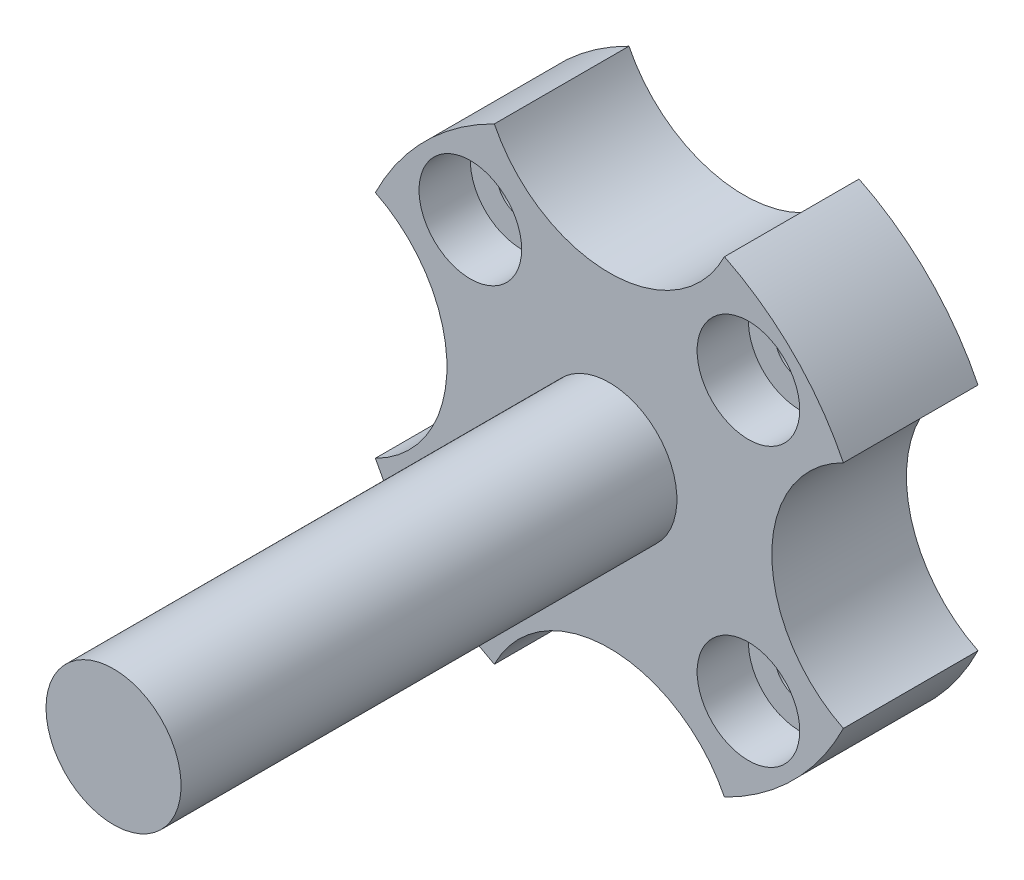
ISO-10303-21;
HEADER;
FILE_DESCRIPTION(('STEP AP214'),'2;1');
FILE_NAME('part.step','',(''),(''),'','','');
FILE_SCHEMA(('AUTOMOTIVE_DESIGN { 1 0 10303 214 1 1 1 1 }'));
ENDSEC;
DATA;
#1=APPLICATION_CONTEXT('core data for automotive mechanical design processes');
#2=APPLICATION_PROTOCOL_DEFINITION('international standard','automotive_design',2000,#1);
#3=PRODUCT_CONTEXT('',#1,'mechanical');
#4=PRODUCT('Part','Part','',(#3));
#5=PRODUCT_RELATED_PRODUCT_CATEGORY('part','',(#4));
#6=PRODUCT_DEFINITION_FORMATION('','',#4);
#7=PRODUCT_DEFINITION_CONTEXT('part definition',#1,'design');
#8=PRODUCT_DEFINITION('design','',#6,#7);
#9=PRODUCT_DEFINITION_SHAPE('','',#8);
#10=(LENGTH_UNIT() NAMED_UNIT(*) SI_UNIT(.MILLI.,.METRE.));
#11=(NAMED_UNIT(*) PLANE_ANGLE_UNIT() SI_UNIT($,.RADIAN.));
#12=(NAMED_UNIT(*) SI_UNIT($,.STERADIAN.) SOLID_ANGLE_UNIT());
#13=UNCERTAINTY_MEASURE_WITH_UNIT(LENGTH_MEASURE(1.E-05),#10,'distance_accuracy_value','');
#14=(GEOMETRIC_REPRESENTATION_CONTEXT(3) GLOBAL_UNCERTAINTY_ASSIGNED_CONTEXT((#13)) GLOBAL_UNIT_ASSIGNED_CONTEXT((#10,
#11,#12)) REPRESENTATION_CONTEXT('',''));
#15=CARTESIAN_POINT('',(0.,0.,0.));
#16=DIRECTION('',(0.,0.,1.));
#17=DIRECTION('',(1.,0.,0.));
#18=AXIS2_PLACEMENT_3D('',#15,#16,#17);
#19=CARTESIAN_POINT('',(-8.13172798364525,8.13172798364531,-4.05907576672322));
#20=DIRECTION('',(0.,0.,1.));
#21=DIRECTION('',(1.,0.,0.));
#22=AXIS2_PLACEMENT_3D('',#19,#20,#21);
#23=CYLINDRICAL_SURFACE('',#22,1.43509999999999);
#24=CARTESIAN_POINT('',(-8.13172798364525,8.13172798364531,0.));
#25=DIRECTION('',(0.,0.,1.));
#26=DIRECTION('',(1.,0.,0.));
#27=AXIS2_PLACEMENT_3D('',#24,#25,#26);
#28=CIRCLE('',#27,1.43509999999999);
#29=CARTESIAN_POINT('',(-6.69662798364527,8.13172798364531,0.));
#30=VERTEX_POINT('',#29);
#31=EDGE_CURVE('E147',#30,#30,#28,.F.);
#32=ORIENTED_EDGE('',*,*,#31,.T.);
#33=EDGE_LOOP('',(#32));
#34=FACE_BOUND('',#33,.T.);
#35=CARTESIAN_POINT('',(-8.13172798364525,8.13172798364531,4.874));
#36=DIRECTION('',(0.,0.,1.));
#37=DIRECTION('',(1.,0.,0.));
#38=AXIS2_PLACEMENT_3D('',#35,#36,#37);
#39=CIRCLE('',#38,1.43509999999999);
#40=CARTESIAN_POINT('',(-6.69662798364527,8.13172798364531,4.874));
#41=VERTEX_POINT('',#40);
#42=EDGE_CURVE('E45',#41,#41,#39,.F.);
#43=ORIENTED_EDGE('',*,*,#42,.F.);
#44=EDGE_LOOP('',(#43));
#45=FACE_BOUND('',#44,.T.);
#46=ADVANCED_FACE('F41',(#34,#45),#23,.F.);
#47=CARTESIAN_POINT('',(8.13172798364526,-8.13172798364531,-4.05907576672322));
#48=DIRECTION('',(0.,0.,1.));
#49=DIRECTION('',(1.,0.,0.));
#50=AXIS2_PLACEMENT_3D('',#47,#48,#49);
#51=CYLINDRICAL_SURFACE('',#50,1.43509999999999);
#52=CARTESIAN_POINT('',(8.13172798364526,-8.13172798364531,0.));
#53=DIRECTION('',(0.,0.,1.));
#54=DIRECTION('',(1.,0.,0.));
#55=AXIS2_PLACEMENT_3D('',#52,#53,#54);
#56=CIRCLE('',#55,1.43509999999999);
#57=CARTESIAN_POINT('',(9.56682798364524,-8.13172798364531,0.));
#58=VERTEX_POINT('',#57);
#59=EDGE_CURVE('E212',#58,#58,#56,.F.);
#60=ORIENTED_EDGE('',*,*,#59,.T.);
#61=EDGE_LOOP('',(#60));
#62=FACE_BOUND('',#61,.T.);
#63=CARTESIAN_POINT('',(8.13172798364526,-8.13172798364531,4.874));
#64=DIRECTION('',(0.,0.,1.));
#65=DIRECTION('',(1.,0.,0.));
#66=AXIS2_PLACEMENT_3D('',#63,#64,#65);
#67=CIRCLE('',#66,1.43509999999999);
#68=CARTESIAN_POINT('',(9.56682798364524,-8.13172798364531,4.874));
#69=VERTEX_POINT('',#68);
#70=EDGE_CURVE('E194',#69,#69,#67,.F.);
#71=ORIENTED_EDGE('',*,*,#70,.F.);
#72=EDGE_LOOP('',(#71));
#73=FACE_BOUND('',#72,.T.);
#74=ADVANCED_FACE('F259',(#62,#73),#51,.F.);
#75=CARTESIAN_POINT('',(-8.13172798364528,-8.13172798364531,-4.05907576672322));
#76=DIRECTION('',(0.,0.,1.));
#77=DIRECTION('',(1.,0.,0.));
#78=AXIS2_PLACEMENT_3D('',#75,#76,#77);
#79=CYLINDRICAL_SURFACE('',#78,1.43509999999999);
#80=CARTESIAN_POINT('',(-8.13172798364528,-8.13172798364531,0.));
#81=DIRECTION('',(0.,0.,1.));
#82=DIRECTION('',(1.,0.,0.));
#83=AXIS2_PLACEMENT_3D('',#80,#81,#82);
#84=CIRCLE('',#83,1.43509999999999);
#85=CARTESIAN_POINT('',(-6.6966279836453,-8.13172798364531,0.));
#86=VERTEX_POINT('',#85);
#87=EDGE_CURVE('E206',#86,#86,#84,.F.);
#88=ORIENTED_EDGE('',*,*,#87,.T.);
#89=EDGE_LOOP('',(#88));
#90=FACE_BOUND('',#89,.T.);
#91=CARTESIAN_POINT('',(-8.13172798364528,-8.13172798364531,4.874));
#92=DIRECTION('',(0.,0.,1.));
#93=DIRECTION('',(1.,0.,0.));
#94=AXIS2_PLACEMENT_3D('',#91,#92,#93);
#95=CIRCLE('',#94,1.43509999999999);
#96=CARTESIAN_POINT('',(-6.6966279836453,-8.13172798364531,4.874));
#97=VERTEX_POINT('',#96);
#98=EDGE_CURVE('E190',#97,#97,#95,.F.);
#99=ORIENTED_EDGE('',*,*,#98,.F.);
#100=EDGE_LOOP('',(#99));
#101=FACE_BOUND('',#100,.T.);
#102=ADVANCED_FACE('F265',(#90,#101),#79,.F.);
#103=CARTESIAN_POINT('',(8.13172798364528,8.13172798364531,-4.05907576672322));
#104=DIRECTION('',(0.,0.,1.));
#105=DIRECTION('',(1.,0.,0.));
#106=AXIS2_PLACEMENT_3D('',#103,#104,#105);
#107=CYLINDRICAL_SURFACE('',#106,1.43509999999999);
#108=CARTESIAN_POINT('',(8.13172798364528,8.13172798364531,0.));
#109=DIRECTION('',(0.,0.,1.));
#110=DIRECTION('',(1.,0.,0.));
#111=AXIS2_PLACEMENT_3D('',#108,#109,#110);
#112=CIRCLE('',#111,1.43509999999999);
#113=CARTESIAN_POINT('',(9.56682798364527,8.13172798364531,0.));
#114=VERTEX_POINT('',#113);
#115=EDGE_CURVE('E201',#114,#114,#112,.F.);
#116=ORIENTED_EDGE('',*,*,#115,.T.);
#117=EDGE_LOOP('',(#116));
#118=FACE_BOUND('',#117,.T.);
#119=CARTESIAN_POINT('',(8.13172798364528,8.13172798364531,4.874));
#120=DIRECTION('',(0.,0.,1.));
#121=DIRECTION('',(1.,0.,0.));
#122=AXIS2_PLACEMENT_3D('',#119,#120,#121);
#123=CIRCLE('',#122,1.43509999999999);
#124=CARTESIAN_POINT('',(9.56682798364527,8.13172798364531,4.874));
#125=VERTEX_POINT('',#124);
#126=EDGE_CURVE('E186',#125,#125,#123,.F.);
#127=ORIENTED_EDGE('',*,*,#126,.F.);
#128=EDGE_LOOP('',(#127));
#129=FACE_BOUND('',#128,.T.);
#130=ADVANCED_FACE('F271',(#118,#129),#107,.F.);
#131=CARTESIAN_POINT('',(0.,17.,7.874));
#132=DIRECTION('',(0.,0.,-1.));
#133=DIRECTION('',(-1.,0.,0.));
#134=AXIS2_PLACEMENT_3D('',#131,#132,#133);
#135=CYLINDRICAL_SURFACE('',#134,7.5);
#136=CARTESIAN_POINT('',(0.,17.,0.));
#137=DIRECTION('',(0.,0.,1.));
#138=DIRECTION('',(1.,0.,0.));
#139=AXIS2_PLACEMENT_3D('',#136,#137,#138);
#140=CIRCLE('',#139,7.5);
#141=CARTESIAN_POINT('',(-6.72793891634486,13.6856617647059,0.));
#142=VERTEX_POINT('',#141);
#143=CARTESIAN_POINT('',(6.72793891634485,13.6856617647059,0.));
#144=VERTEX_POINT('',#143);
#145=EDGE_CURVE('E142',#142,#144,#140,.T.);
#146=ORIENTED_EDGE('',*,*,#145,.F.);
#147=DIRECTION('',(0.,0.,-1.));
#148=VECTOR('',#147,1.);
#149=CARTESIAN_POINT('',(-6.72793891634486,13.6856617647059,7.874));
#150=LINE('',#149,#148);
#151=CARTESIAN_POINT('',(-6.72793891634486,13.6856617647059,7.874));
#152=VERTEX_POINT('',#151);
#153=EDGE_CURVE('E11',#152,#142,#150,.T.);
#154=ORIENTED_EDGE('',*,*,#153,.F.);
#155=CARTESIAN_POINT('',(0.,17.,7.874));
#156=DIRECTION('',(0.,0.,1.));
#157=DIRECTION('',(1.,0.,0.));
#158=AXIS2_PLACEMENT_3D('',#155,#156,#157);
#159=CIRCLE('',#158,7.5);
#160=CARTESIAN_POINT('',(6.72793891634485,13.6856617647059,7.874));
#161=VERTEX_POINT('',#160);
#162=EDGE_CURVE('E171',#152,#161,#159,.T.);
#163=ORIENTED_EDGE('',*,*,#162,.T.);
#164=DIRECTION('',(0.,0.,-1.));
#165=VECTOR('',#164,1.);
#166=CARTESIAN_POINT('',(6.72793891634485,13.6856617647059,7.874));
#167=LINE('',#166,#165);
#168=EDGE_CURVE('E95',#161,#144,#167,.T.);
#169=ORIENTED_EDGE('',*,*,#168,.T.);
#170=EDGE_LOOP('',(#146,#154,#163,#169));
#171=FACE_BOUND('',#170,.T.);
#172=ADVANCED_FACE('F43',(#171),#135,.F.);
#173=CARTESIAN_POINT('',(0.,0.,7.874));
#174=DIRECTION('',(0.,0.,-1.));
#175=DIRECTION('',(-1.,0.,0.));
#176=AXIS2_PLACEMENT_3D('',#173,#174,#175);
#177=CYLINDRICAL_SURFACE('',#176,15.25);
#178=CARTESIAN_POINT('',(0.,0.,0.));
#179=DIRECTION('',(0.,0.,1.));
#180=DIRECTION('',(1.,0.,0.));
#181=AXIS2_PLACEMENT_3D('',#178,#179,#180);
#182=CIRCLE('',#181,15.25);
#183=CARTESIAN_POINT('',(-13.6856617647059,6.72793891634485,0.));
#184=VERTEX_POINT('',#183);
#185=EDGE_CURVE('E146',#142,#184,#182,.T.);
#186=ORIENTED_EDGE('',*,*,#185,.T.);
#187=DIRECTION('',(0.,0.,-1.));
#188=VECTOR('',#187,1.);
#189=CARTESIAN_POINT('',(-13.6856617647059,6.72793891634485,7.874));
#190=LINE('',#189,#188);
#191=CARTESIAN_POINT('',(-13.6856617647059,6.72793891634485,7.874));
#192=VERTEX_POINT('',#191);
#193=EDGE_CURVE('E52',#192,#184,#190,.T.);
#194=ORIENTED_EDGE('',*,*,#193,.F.);
#195=CARTESIAN_POINT('',(0.,0.,7.874));
#196=DIRECTION('',(0.,0.,1.));
#197=DIRECTION('',(1.,0.,0.));
#198=AXIS2_PLACEMENT_3D('',#195,#196,#197);
#199=CIRCLE('',#198,15.25);
#200=EDGE_CURVE('E221',#152,#192,#199,.T.);
#201=ORIENTED_EDGE('',*,*,#200,.F.);
#202=ORIENTED_EDGE('',*,*,#153,.T.);
#203=EDGE_LOOP('',(#186,#194,#201,#202));
#204=FACE_BOUND('',#203,.T.);
#205=ADVANCED_FACE('F243',(#204),#177,.T.);
#206=CARTESIAN_POINT('',(-17.,0.,7.874));
#207=DIRECTION('',(0.,0.,-1.));
#208=DIRECTION('',(-1.,0.,0.));
#209=AXIS2_PLACEMENT_3D('',#206,#207,#208);
#210=CYLINDRICAL_SURFACE('',#209,7.5);
#211=CARTESIAN_POINT('',(-17.,0.,0.));
#212=DIRECTION('',(0.,0.,1.));
#213=DIRECTION('',(1.,0.,0.));
#214=AXIS2_PLACEMENT_3D('',#211,#212,#213);
#215=CIRCLE('',#214,7.5);
#216=CARTESIAN_POINT('',(-13.6856617647059,-6.72793891634485,0.));
#217=VERTEX_POINT('',#216);
#218=EDGE_CURVE('E151',#217,#184,#215,.T.);
#219=ORIENTED_EDGE('',*,*,#218,.F.);
#220=DIRECTION('',(0.,0.,-1.));
#221=VECTOR('',#220,1.);
#222=CARTESIAN_POINT('',(-13.6856617647059,-6.72793891634485,7.874));
#223=LINE('',#222,#221);
#224=CARTESIAN_POINT('',(-13.6856617647059,-6.72793891634485,7.874));
#225=VERTEX_POINT('',#224);
#226=EDGE_CURVE('E181',#225,#217,#223,.T.);
#227=ORIENTED_EDGE('',*,*,#226,.F.);
#228=CARTESIAN_POINT('',(-17.,0.,7.874));
#229=DIRECTION('',(0.,0.,1.));
#230=DIRECTION('',(1.,0.,0.));
#231=AXIS2_PLACEMENT_3D('',#228,#229,#230);
#232=CIRCLE('',#231,7.5);
#233=EDGE_CURVE('E224',#225,#192,#232,.T.);
#234=ORIENTED_EDGE('',*,*,#233,.T.);
#235=ORIENTED_EDGE('',*,*,#193,.T.);
#236=EDGE_LOOP('',(#219,#227,#234,#235));
#237=FACE_BOUND('',#236,.T.);
#238=ADVANCED_FACE('F246',(#237),#210,.F.);
#239=CARTESIAN_POINT('',(0.,0.,7.874));
#240=DIRECTION('',(0.,0.,-1.));
#241=DIRECTION('',(-1.,0.,0.));
#242=AXIS2_PLACEMENT_3D('',#239,#240,#241);
#243=CYLINDRICAL_SURFACE('',#242,15.25);
#244=CARTESIAN_POINT('',(0.,0.,0.));
#245=DIRECTION('',(0.,0.,1.));
#246=DIRECTION('',(1.,0.,0.));
#247=AXIS2_PLACEMENT_3D('',#244,#245,#246);
#248=CIRCLE('',#247,15.25);
#249=CARTESIAN_POINT('',(-6.72793891634485,-13.6856617647059,0.));
#250=VERTEX_POINT('',#249);
#251=EDGE_CURVE('E155',#217,#250,#248,.T.);
#252=ORIENTED_EDGE('',*,*,#251,.T.);
#253=DIRECTION('',(0.,0.,-1.));
#254=VECTOR('',#253,1.);
#255=CARTESIAN_POINT('',(-6.72793891634485,-13.6856617647059,7.874));
#256=LINE('',#255,#254);
#257=CARTESIAN_POINT('',(-6.72793891634485,-13.6856617647059,7.874));
#258=VERTEX_POINT('',#257);
#259=EDGE_CURVE('E178',#258,#250,#256,.T.);
#260=ORIENTED_EDGE('',*,*,#259,.F.);
#261=CARTESIAN_POINT('',(0.,0.,7.874));
#262=DIRECTION('',(0.,0.,1.));
#263=DIRECTION('',(1.,0.,0.));
#264=AXIS2_PLACEMENT_3D('',#261,#262,#263);
#265=CIRCLE('',#264,15.25);
#266=EDGE_CURVE('E228',#225,#258,#265,.T.);
#267=ORIENTED_EDGE('',*,*,#266,.F.);
#268=ORIENTED_EDGE('',*,*,#226,.T.);
#269=EDGE_LOOP('',(#252,#260,#267,#268));
#270=FACE_BOUND('',#269,.T.);
#271=ADVANCED_FACE('F249',(#270),#243,.T.);
#272=CARTESIAN_POINT('',(0.,-17.,7.874));
#273=DIRECTION('',(0.,0.,-1.));
#274=DIRECTION('',(-1.,0.,0.));
#275=AXIS2_PLACEMENT_3D('',#272,#273,#274);
#276=CYLINDRICAL_SURFACE('',#275,7.5);
#277=CARTESIAN_POINT('',(0.,-17.,0.));
#278=DIRECTION('',(0.,0.,1.));
#279=DIRECTION('',(1.,0.,0.));
#280=AXIS2_PLACEMENT_3D('',#277,#278,#279);
#281=CIRCLE('',#280,7.5);
#282=CARTESIAN_POINT('',(6.72793891634485,-13.6856617647059,0.));
#283=VERTEX_POINT('',#282);
#284=EDGE_CURVE('E159',#283,#250,#281,.T.);
#285=ORIENTED_EDGE('',*,*,#284,.F.);
#286=DIRECTION('',(0.,0.,-1.));
#287=VECTOR('',#286,1.);
#288=CARTESIAN_POINT('',(6.72793891634485,-13.6856617647059,7.874));
#289=LINE('',#288,#287);
#290=CARTESIAN_POINT('',(6.72793891634485,-13.6856617647059,7.874));
#291=VERTEX_POINT('',#290);
#292=EDGE_CURVE('E133',#291,#283,#289,.T.);
#293=ORIENTED_EDGE('',*,*,#292,.F.);
#294=CARTESIAN_POINT('',(0.,-17.,7.874));
#295=DIRECTION('',(0.,0.,1.));
#296=DIRECTION('',(1.,0.,0.));
#297=AXIS2_PLACEMENT_3D('',#294,#295,#296);
#298=CIRCLE('',#297,7.5);
#299=EDGE_CURVE('E120',#291,#258,#298,.T.);
#300=ORIENTED_EDGE('',*,*,#299,.T.);
#301=ORIENTED_EDGE('',*,*,#259,.T.);
#302=EDGE_LOOP('',(#285,#293,#300,#301));
#303=FACE_BOUND('',#302,.T.);
#304=ADVANCED_FACE('F233',(#303),#276,.F.);
#305=CARTESIAN_POINT('',(0.,0.,7.874));
#306=DIRECTION('',(0.,0.,-1.));
#307=DIRECTION('',(-1.,0.,0.));
#308=AXIS2_PLACEMENT_3D('',#305,#306,#307);
#309=CYLINDRICAL_SURFACE('',#308,15.25);
#310=CARTESIAN_POINT('',(0.,0.,0.));
#311=DIRECTION('',(0.,0.,1.));
#312=DIRECTION('',(1.,0.,0.));
#313=AXIS2_PLACEMENT_3D('',#310,#311,#312);
#314=CIRCLE('',#313,15.25);
#315=CARTESIAN_POINT('',(13.6856617647059,-6.72793891634485,0.));
#316=VERTEX_POINT('',#315);
#317=EDGE_CURVE('E128',#283,#316,#314,.T.);
#318=ORIENTED_EDGE('',*,*,#317,.T.);
#319=DIRECTION('',(0.,0.,-1.));
#320=VECTOR('',#319,1.);
#321=CARTESIAN_POINT('',(13.6856617647059,-6.72793891634485,7.874));
#322=LINE('',#321,#320);
#323=CARTESIAN_POINT('',(13.6856617647059,-6.72793891634485,7.874));
#324=VERTEX_POINT('',#323);
#325=EDGE_CURVE('E125',#324,#316,#322,.T.);
#326=ORIENTED_EDGE('',*,*,#325,.F.);
#327=CARTESIAN_POINT('',(0.,0.,7.874));
#328=DIRECTION('',(0.,0.,1.));
#329=DIRECTION('',(1.,0.,0.));
#330=AXIS2_PLACEMENT_3D('',#327,#328,#329);
#331=CIRCLE('',#330,15.25);
#332=EDGE_CURVE('E114',#291,#324,#331,.T.);
#333=ORIENTED_EDGE('',*,*,#332,.F.);
#334=ORIENTED_EDGE('',*,*,#292,.T.);
#335=EDGE_LOOP('',(#318,#326,#333,#334));
#336=FACE_BOUND('',#335,.T.);
#337=ADVANCED_FACE('F126',(#336),#309,.T.);
#338=CARTESIAN_POINT('',(17.,0.,7.874));
#339=DIRECTION('',(0.,0.,-1.));
#340=DIRECTION('',(-1.,0.,0.));
#341=AXIS2_PLACEMENT_3D('',#338,#339,#340);
#342=CYLINDRICAL_SURFACE('',#341,7.5);
#343=CARTESIAN_POINT('',(17.,0.,0.));
#344=DIRECTION('',(0.,0.,1.));
#345=DIRECTION('',(1.,0.,0.));
#346=AXIS2_PLACEMENT_3D('',#343,#344,#345);
#347=CIRCLE('',#346,7.5);
#348=CARTESIAN_POINT('',(13.6856617647059,6.72793891634485,0.));
#349=VERTEX_POINT('',#348);
#350=EDGE_CURVE('E165',#349,#316,#347,.T.);
#351=ORIENTED_EDGE('',*,*,#350,.F.);
#352=DIRECTION('',(0.,0.,-1.));
#353=VECTOR('',#352,1.);
#354=CARTESIAN_POINT('',(13.6856617647059,6.72793891634485,7.874));
#355=LINE('',#354,#353);
#356=CARTESIAN_POINT('',(13.6856617647059,6.72793891634485,7.874));
#357=VERTEX_POINT('',#356);
#358=EDGE_CURVE('E88',#357,#349,#355,.T.);
#359=ORIENTED_EDGE('',*,*,#358,.F.);
#360=CARTESIAN_POINT('',(17.,0.,7.874));
#361=DIRECTION('',(0.,0.,1.));
#362=DIRECTION('',(1.,0.,0.));
#363=AXIS2_PLACEMENT_3D('',#360,#361,#362);
#364=CIRCLE('',#363,7.5);
#365=EDGE_CURVE('E118',#357,#324,#364,.T.);
#366=ORIENTED_EDGE('',*,*,#365,.T.);
#367=ORIENTED_EDGE('',*,*,#325,.T.);
#368=EDGE_LOOP('',(#351,#359,#366,#367));
#369=FACE_BOUND('',#368,.T.);
#370=ADVANCED_FACE('F135',(#369),#342,.F.);
#371=CARTESIAN_POINT('',(0.,0.,7.874));
#372=DIRECTION('',(0.,0.,-1.));
#373=DIRECTION('',(-1.,0.,0.));
#374=AXIS2_PLACEMENT_3D('',#371,#372,#373);
#375=CYLINDRICAL_SURFACE('',#374,15.25);
#376=CARTESIAN_POINT('',(0.,0.,0.));
#377=DIRECTION('',(0.,0.,1.));
#378=DIRECTION('',(1.,0.,0.));
#379=AXIS2_PLACEMENT_3D('',#376,#377,#378);
#380=CIRCLE('',#379,15.25);
#381=EDGE_CURVE('E168',#349,#144,#380,.T.);
#382=ORIENTED_EDGE('',*,*,#381,.T.);
#383=ORIENTED_EDGE('',*,*,#168,.F.);
#384=CARTESIAN_POINT('',(0.,0.,7.874));
#385=DIRECTION('',(0.,0.,1.));
#386=DIRECTION('',(1.,0.,0.));
#387=AXIS2_PLACEMENT_3D('',#384,#385,#386);
#388=CIRCLE('',#387,15.25);
#389=EDGE_CURVE('E61',#357,#161,#388,.T.);
#390=ORIENTED_EDGE('',*,*,#389,.F.);
#391=ORIENTED_EDGE('',*,*,#358,.T.);
#392=EDGE_LOOP('',(#382,#383,#390,#391));
#393=FACE_BOUND('',#392,.T.);
#394=ADVANCED_FACE('F239',(#393),#375,.T.);
#395=CARTESIAN_POINT('',(0.,0.,7.874));
#396=DIRECTION('',(0.,0.,1.));
#397=DIRECTION('',(1.,0.,0.));
#398=AXIS2_PLACEMENT_3D('',#395,#396,#397);
#399=PLANE('',#398);
#400=CARTESIAN_POINT('',(0.,0.,7.874));
#401=DIRECTION('',(0.,0.,1.));
#402=DIRECTION('',(1.,0.,0.));
#403=AXIS2_PLACEMENT_3D('',#400,#401,#402);
#404=CIRCLE('',#403,3.95);
#405=CARTESIAN_POINT('',(-3.95,0.,7.874));
#406=VERTEX_POINT('',#405);
#407=EDGE_CURVE('E516',#406,#406,#404,.T.);
#408=ORIENTED_EDGE('',*,*,#407,.F.);
#409=EDGE_LOOP('',(#408));
#410=FACE_BOUND('',#409,.T.);
#411=CARTESIAN_POINT('',(8.13172798364528,8.13172798364531,7.874));
#412=DIRECTION('',(0.,0.,1.));
#413=DIRECTION('',(1.,0.,0.));
#414=AXIS2_PLACEMENT_3D('',#411,#412,#413);
#415=CIRCLE('',#414,3.);
#416=CARTESIAN_POINT('',(11.1317279836453,8.13172798364531,7.874));
#417=VERTEX_POINT('',#416);
#418=EDGE_CURVE('E492',#417,#417,#415,.T.);
#419=ORIENTED_EDGE('',*,*,#418,.F.);
#420=EDGE_LOOP('',(#419));
#421=FACE_BOUND('',#420,.T.);
#422=CARTESIAN_POINT('',(8.13172798364526,-8.13172798364531,7.874));
#423=DIRECTION('',(0.,0.,1.));
#424=DIRECTION('',(1.,0.,0.));
#425=AXIS2_PLACEMENT_3D('',#422,#423,#424);
#426=CIRCLE('',#425,3.);
#427=CARTESIAN_POINT('',(11.1317279836453,-8.13172798364531,7.874));
#428=VERTEX_POINT('',#427);
#429=EDGE_CURVE('E501',#428,#428,#426,.T.);
#430=ORIENTED_EDGE('',*,*,#429,.F.);
#431=EDGE_LOOP('',(#430));
#432=FACE_BOUND('',#431,.T.);
#433=CARTESIAN_POINT('',(-8.13172798364528,-8.13172798364531,7.874));
#434=DIRECTION('',(0.,0.,1.));
#435=DIRECTION('',(1.,0.,0.));
#436=AXIS2_PLACEMENT_3D('',#433,#434,#435);
#437=CIRCLE('',#436,3.);
#438=CARTESIAN_POINT('',(-5.13172798364528,-8.13172798364531,7.874));
#439=VERTEX_POINT('',#438);
#440=EDGE_CURVE('E509',#439,#439,#437,.T.);
#441=ORIENTED_EDGE('',*,*,#440,.F.);
#442=EDGE_LOOP('',(#441));
#443=FACE_BOUND('',#442,.T.);
#444=CARTESIAN_POINT('',(-8.13172798364525,8.13172798364531,7.874));
#445=DIRECTION('',(0.,0.,1.));
#446=DIRECTION('',(1.,0.,0.));
#447=AXIS2_PLACEMENT_3D('',#444,#445,#446);
#448=CIRCLE('',#447,3.);
#449=CARTESIAN_POINT('',(-5.13172798364525,8.13172798364531,7.874));
#450=VERTEX_POINT('',#449);
#451=EDGE_CURVE('E484',#450,#450,#448,.T.);
#452=ORIENTED_EDGE('',*,*,#451,.F.);
#453=EDGE_LOOP('',(#452));
#454=FACE_BOUND('',#453,.T.);
#455=ORIENTED_EDGE('',*,*,#162,.F.);
#456=ORIENTED_EDGE('',*,*,#200,.T.);
#457=ORIENTED_EDGE('',*,*,#233,.F.);
#458=ORIENTED_EDGE('',*,*,#266,.T.);
#459=ORIENTED_EDGE('',*,*,#299,.F.);
#460=ORIENTED_EDGE('',*,*,#332,.T.);
#461=ORIENTED_EDGE('',*,*,#365,.F.);
#462=ORIENTED_EDGE('',*,*,#389,.T.);
#463=EDGE_LOOP('',(#455,#456,#457,#458,#459,#460,#461,#462));
#464=FACE_BOUND('',#463,.T.);
#465=ADVANCED_FACE('F116',(#410,#421,#432,#443,#454,#464),#399,.T.);
#466=CARTESIAN_POINT('',(0.,0.,0.));
#467=DIRECTION('',(0.,0.,1.));
#468=DIRECTION('',(1.,0.,0.));
#469=AXIS2_PLACEMENT_3D('',#466,#467,#468);
#470=PLANE('',#469);
#471=ORIENTED_EDGE('',*,*,#115,.F.);
#472=EDGE_LOOP('',(#471));
#473=FACE_BOUND('',#472,.T.);
#474=ORIENTED_EDGE('',*,*,#87,.F.);
#475=EDGE_LOOP('',(#474));
#476=FACE_BOUND('',#475,.T.);
#477=ORIENTED_EDGE('',*,*,#59,.F.);
#478=EDGE_LOOP('',(#477));
#479=FACE_BOUND('',#478,.T.);
#480=ORIENTED_EDGE('',*,*,#31,.F.);
#481=EDGE_LOOP('',(#480));
#482=FACE_BOUND('',#481,.T.);
#483=ORIENTED_EDGE('',*,*,#145,.T.);
#484=ORIENTED_EDGE('',*,*,#381,.F.);
#485=ORIENTED_EDGE('',*,*,#350,.T.);
#486=ORIENTED_EDGE('',*,*,#317,.F.);
#487=ORIENTED_EDGE('',*,*,#284,.T.);
#488=ORIENTED_EDGE('',*,*,#251,.F.);
#489=ORIENTED_EDGE('',*,*,#218,.T.);
#490=ORIENTED_EDGE('',*,*,#185,.F.);
#491=EDGE_LOOP('',(#483,#484,#485,#486,#487,#488,#489,#490));
#492=FACE_BOUND('',#491,.T.);
#493=ADVANCED_FACE('F236',(#473,#476,#479,#482,#492),#470,.F.);
#494=CARTESIAN_POINT('',(8.13172798364528,8.13172798364531,4.874));
#495=DIRECTION('',(0.,0.,1.));
#496=DIRECTION('',(1.,0.,0.));
#497=AXIS2_PLACEMENT_3D('',#494,#495,#496);
#498=PLANE('',#497);
#499=CARTESIAN_POINT('',(8.13172798364528,8.13172798364531,4.874));
#500=DIRECTION('',(0.,0.,1.));
#501=DIRECTION('',(1.,0.,0.));
#502=AXIS2_PLACEMENT_3D('',#499,#500,#501);
#503=CIRCLE('',#502,3.);
#504=CARTESIAN_POINT('',(11.1317279836453,8.13172798364531,4.874));
#505=VERTEX_POINT('',#504);
#506=EDGE_CURVE('E496',#505,#505,#503,.T.);
#507=ORIENTED_EDGE('',*,*,#506,.T.);
#508=EDGE_LOOP('',(#507));
#509=FACE_BOUND('',#508,.T.);
#510=ORIENTED_EDGE('',*,*,#126,.T.);
#511=EDGE_LOOP('',(#510));
#512=FACE_BOUND('',#511,.T.);
#513=ADVANCED_FACE('F278',(#509,#512),#498,.T.);
#514=CARTESIAN_POINT('',(8.13172798364528,8.13172798364531,4.874));
#515=DIRECTION('',(0.,0.,1.));
#516=DIRECTION('',(1.,0.,0.));
#517=AXIS2_PLACEMENT_3D('',#514,#515,#516);
#518=CYLINDRICAL_SURFACE('',#517,3.);
#519=ORIENTED_EDGE('',*,*,#506,.F.);
#520=EDGE_LOOP('',(#519));
#521=FACE_BOUND('',#520,.T.);
#522=ORIENTED_EDGE('',*,*,#418,.T.);
#523=EDGE_LOOP('',(#522));
#524=FACE_BOUND('',#523,.T.);
#525=ADVANCED_FACE('F313',(#521,#524),#518,.F.);
#526=CARTESIAN_POINT('',(-8.13172798364528,-8.13172798364531,4.874));
#527=DIRECTION('',(0.,0.,1.));
#528=DIRECTION('',(1.,0.,0.));
#529=AXIS2_PLACEMENT_3D('',#526,#527,#528);
#530=PLANE('',#529);
#531=CARTESIAN_POINT('',(-8.13172798364528,-8.13172798364531,4.874));
#532=DIRECTION('',(0.,0.,1.));
#533=DIRECTION('',(1.,0.,0.));
#534=AXIS2_PLACEMENT_3D('',#531,#532,#533);
#535=CIRCLE('',#534,3.);
#536=CARTESIAN_POINT('',(-5.13172798364528,-8.13172798364531,4.874));
#537=VERTEX_POINT('',#536);
#538=EDGE_CURVE('E488',#537,#537,#535,.T.);
#539=ORIENTED_EDGE('',*,*,#538,.T.);
#540=EDGE_LOOP('',(#539));
#541=FACE_BOUND('',#540,.T.);
#542=ORIENTED_EDGE('',*,*,#98,.T.);
#543=EDGE_LOOP('',(#542));
#544=FACE_BOUND('',#543,.T.);
#545=ADVANCED_FACE('F322',(#541,#544),#530,.T.);
#546=CARTESIAN_POINT('',(-8.13172798364528,-8.13172798364531,4.874));
#547=DIRECTION('',(0.,0.,1.));
#548=DIRECTION('',(1.,0.,0.));
#549=AXIS2_PLACEMENT_3D('',#546,#547,#548);
#550=CYLINDRICAL_SURFACE('',#549,3.);
#551=ORIENTED_EDGE('',*,*,#538,.F.);
#552=EDGE_LOOP('',(#551));
#553=FACE_BOUND('',#552,.T.);
#554=ORIENTED_EDGE('',*,*,#440,.T.);
#555=EDGE_LOOP('',(#554));
#556=FACE_BOUND('',#555,.T.);
#557=ADVANCED_FACE('F330',(#553,#556),#550,.F.);
#558=CARTESIAN_POINT('',(8.13172798364526,-8.13172798364531,4.874));
#559=DIRECTION('',(0.,0.,1.));
#560=DIRECTION('',(1.,0.,0.));
#561=AXIS2_PLACEMENT_3D('',#558,#559,#560);
#562=PLANE('',#561);
#563=CARTESIAN_POINT('',(8.13172798364526,-8.13172798364531,4.874));
#564=DIRECTION('',(0.,0.,1.));
#565=DIRECTION('',(1.,0.,0.));
#566=AXIS2_PLACEMENT_3D('',#563,#564,#565);
#567=CIRCLE('',#566,3.);
#568=CARTESIAN_POINT('',(11.1317279836453,-8.13172798364531,4.874));
#569=VERTEX_POINT('',#568);
#570=EDGE_CURVE('E505',#569,#569,#567,.T.);
#571=ORIENTED_EDGE('',*,*,#570,.T.);
#572=EDGE_LOOP('',(#571));
#573=FACE_BOUND('',#572,.T.);
#574=ORIENTED_EDGE('',*,*,#70,.T.);
#575=EDGE_LOOP('',(#574));
#576=FACE_BOUND('',#575,.T.);
#577=ADVANCED_FACE('F338',(#573,#576),#562,.T.);
#578=CARTESIAN_POINT('',(8.13172798364526,-8.13172798364531,4.874));
#579=DIRECTION('',(0.,0.,1.));
#580=DIRECTION('',(1.,0.,0.));
#581=AXIS2_PLACEMENT_3D('',#578,#579,#580);
#582=CYLINDRICAL_SURFACE('',#581,3.);
#583=ORIENTED_EDGE('',*,*,#570,.F.);
#584=EDGE_LOOP('',(#583));
#585=FACE_BOUND('',#584,.T.);
#586=ORIENTED_EDGE('',*,*,#429,.T.);
#587=EDGE_LOOP('',(#586));
#588=FACE_BOUND('',#587,.T.);
#589=ADVANCED_FACE('F346',(#585,#588),#582,.F.);
#590=CARTESIAN_POINT('',(-8.13172798364525,8.13172798364531,4.874));
#591=DIRECTION('',(0.,0.,1.));
#592=DIRECTION('',(1.,0.,0.));
#593=AXIS2_PLACEMENT_3D('',#590,#591,#592);
#594=PLANE('',#593);
#595=CARTESIAN_POINT('',(-8.13172798364525,8.13172798364531,4.874));
#596=DIRECTION('',(0.,0.,1.));
#597=DIRECTION('',(1.,0.,0.));
#598=AXIS2_PLACEMENT_3D('',#595,#596,#597);
#599=CIRCLE('',#598,3.);
#600=CARTESIAN_POINT('',(-5.13172798364525,8.13172798364531,4.874));
#601=VERTEX_POINT('',#600);
#602=EDGE_CURVE('E191',#601,#601,#599,.T.);
#603=ORIENTED_EDGE('',*,*,#602,.T.);
#604=EDGE_LOOP('',(#603));
#605=FACE_BOUND('',#604,.T.);
#606=ORIENTED_EDGE('',*,*,#42,.T.);
#607=EDGE_LOOP('',(#606));
#608=FACE_BOUND('',#607,.T.);
#609=ADVANCED_FACE('F354',(#605,#608),#594,.T.);
#610=CARTESIAN_POINT('',(-8.13172798364525,8.13172798364531,4.874));
#611=DIRECTION('',(0.,0.,1.));
#612=DIRECTION('',(1.,0.,0.));
#613=AXIS2_PLACEMENT_3D('',#610,#611,#612);
#614=CYLINDRICAL_SURFACE('',#613,3.);
#615=ORIENTED_EDGE('',*,*,#602,.F.);
#616=EDGE_LOOP('',(#615));
#617=FACE_BOUND('',#616,.T.);
#618=ORIENTED_EDGE('',*,*,#451,.T.);
#619=EDGE_LOOP('',(#618));
#620=FACE_BOUND('',#619,.T.);
#621=ADVANCED_FACE('F362',(#617,#620),#614,.F.);
#622=CARTESIAN_POINT('',(0.,0.,36.874));
#623=DIRECTION('',(0.,0.,-1.));
#624=DIRECTION('',(-1.,0.,0.));
#625=AXIS2_PLACEMENT_3D('',#622,#623,#624);
#626=CYLINDRICAL_SURFACE('',#625,3.95);
#627=CARTESIAN_POINT('',(0.,0.,36.874));
#628=DIRECTION('',(0.,0.,1.));
#629=DIRECTION('',(1.,0.,0.));
#630=AXIS2_PLACEMENT_3D('',#627,#628,#629);
#631=CIRCLE('',#630,3.95);
#632=CARTESIAN_POINT('',(-3.95,0.,36.874));
#633=VERTEX_POINT('',#632);
#634=EDGE_CURVE('E497',#633,#633,#631,.T.);
#635=CARTESIAN_POINT('',(-3.95,0.,36.874));
#636=CARTESIAN_POINT('',(-3.95,0.,36.5719166666667));
#637=CARTESIAN_POINT('',(-3.95,0.,36.2698333333333));
#638=CARTESIAN_POINT('',(-3.95,0.,35.6656666666667));
#639=CARTESIAN_POINT('',(-3.95,0.,35.3635833333333));
#640=CARTESIAN_POINT('',(-3.95,0.,34.7594166666667));
#641=CARTESIAN_POINT('',(-3.95,0.,34.4573333333333));
#642=CARTESIAN_POINT('',(-3.95,0.,33.8531666666667));
#643=CARTESIAN_POINT('',(-3.95,0.,33.5510833333333));
#644=CARTESIAN_POINT('',(-3.95,0.,32.9469166666667));
#645=CARTESIAN_POINT('',(-3.95,0.,32.6448333333333));
#646=CARTESIAN_POINT('',(-3.95,0.,32.0406666666667));
#647=CARTESIAN_POINT('',(-3.95,0.,31.7385833333333));
#648=CARTESIAN_POINT('',(-3.95,0.,31.1344166666667));
#649=CARTESIAN_POINT('',(-3.95,0.,30.8323333333333));
#650=CARTESIAN_POINT('',(-3.95,0.,30.2281666666667));
#651=CARTESIAN_POINT('',(-3.95,0.,29.9260833333333));
#652=CARTESIAN_POINT('',(-3.95,0.,29.3219166666667));
#653=CARTESIAN_POINT('',(-3.95,0.,29.0198333333333));
#654=CARTESIAN_POINT('',(-3.95,0.,28.4156666666667));
#655=CARTESIAN_POINT('',(-3.95,0.,28.1135833333333));
#656=CARTESIAN_POINT('',(-3.95,0.,27.5094166666667));
#657=CARTESIAN_POINT('',(-3.95,0.,27.2073333333333));
#658=CARTESIAN_POINT('',(-3.95,0.,26.6031666666667));
#659=CARTESIAN_POINT('',(-3.95,0.,26.3010833333333));
#660=CARTESIAN_POINT('',(-3.95,0.,25.6969166666667));
#661=CARTESIAN_POINT('',(-3.95,0.,25.3948333333333));
#662=CARTESIAN_POINT('',(-3.95,0.,24.7906666666667));
#663=CARTESIAN_POINT('',(-3.95,0.,24.4885833333333));
#664=CARTESIAN_POINT('',(-3.95,0.,23.8844166666667));
#665=CARTESIAN_POINT('',(-3.95,0.,23.5823333333333));
#666=CARTESIAN_POINT('',(-3.95,0.,22.9781666666667));
#667=CARTESIAN_POINT('',(-3.95,0.,22.6760833333333));
#668=CARTESIAN_POINT('',(-3.95,0.,22.0719166666667));
#669=CARTESIAN_POINT('',(-3.95,0.,21.7698333333333));
#670=CARTESIAN_POINT('',(-3.95,0.,21.1656666666667));
#671=CARTESIAN_POINT('',(-3.95,0.,20.8635833333333));
#672=CARTESIAN_POINT('',(-3.95,0.,20.2594166666667));
#673=CARTESIAN_POINT('',(-3.95,0.,19.9573333333333));
#674=CARTESIAN_POINT('',(-3.95,0.,19.3531666666667));
#675=CARTESIAN_POINT('',(-3.95,0.,19.0510833333333));
#676=CARTESIAN_POINT('',(-3.95,0.,18.4469166666667));
#677=CARTESIAN_POINT('',(-3.95,0.,18.1448333333333));
#678=CARTESIAN_POINT('',(-3.95,0.,17.5406666666667));
#679=CARTESIAN_POINT('',(-3.95,0.,17.2385833333333));
#680=CARTESIAN_POINT('',(-3.95,0.,16.6344166666667));
#681=CARTESIAN_POINT('',(-3.95,0.,16.3323333333333));
#682=CARTESIAN_POINT('',(-3.95,0.,15.7281666666667));
#683=CARTESIAN_POINT('',(-3.95,0.,15.4260833333333));
#684=CARTESIAN_POINT('',(-3.95,0.,14.8219166666667));
#685=CARTESIAN_POINT('',(-3.95,0.,14.5198333333333));
#686=CARTESIAN_POINT('',(-3.95,0.,13.9156666666667));
#687=CARTESIAN_POINT('',(-3.95,0.,13.6135833333333));
#688=CARTESIAN_POINT('',(-3.95,0.,13.0094166666667));
#689=CARTESIAN_POINT('',(-3.95,0.,12.7073333333333));
#690=CARTESIAN_POINT('',(-3.95,0.,12.1031666666667));
#691=CARTESIAN_POINT('',(-3.95,0.,11.8010833333333));
#692=CARTESIAN_POINT('',(-3.95,0.,11.1969166666667));
#693=CARTESIAN_POINT('',(-3.95,0.,10.8948333333333));
#694=CARTESIAN_POINT('',(-3.95,0.,10.2906666666667));
#695=CARTESIAN_POINT('',(-3.95,0.,9.98858333333333));
#696=CARTESIAN_POINT('',(-3.95,0.,9.38441666666666));
#697=CARTESIAN_POINT('',(-3.95,0.,9.08233333333333));
#698=CARTESIAN_POINT('',(-3.95,0.,8.47816666666666));
#699=CARTESIAN_POINT('',(-3.95,0.,8.17608333333333));
#700=CARTESIAN_POINT('',(-3.95,0.,7.874));
#701=B_SPLINE_CURVE_WITH_KNOTS('',3,(#635,#636,#637,#638,#639,#640,#641,#642,#643,#644,#645,
#646,#647,#648,#649,#650,#651,#652,#653,#654,#655,#656,#657,#658,#659,#660,#661,#662,#663,#664,
#665,#666,#667,#668,#669,#670,#671,#672,#673,#674,#675,#676,#677,#678,#679,#680,#681,#682,#683,
#684,#685,#686,#687,#688,#689,#690,#691,#692,#693,#694,#695,#696,#697,#698,#699,#700),
.UNSPECIFIED.,.F.,.F.,(4,2,2,2,2,2,2,2,2,2,2,2,2,2,2,2,2,2,2,2,2,2,2,2,2,2,2,2,2,2,2,2,4),(0.,
0.906249999999997,1.81249999999999,2.71875,3.625,4.53124999999999,5.4375,6.34375,7.25,8.15625,
9.0625,9.96875,10.875,11.78125,12.6875,13.59375,14.5,15.40625,16.3125,17.21875,18.125,19.03125,
19.9375,20.84375,21.75,22.65625,23.5625,24.46875,25.375,26.28125,27.1875,28.09375,29.),.UNSPECIFIED.);
#702=EDGE_CURVE('BSEAM369',#633,#406,#701,.T.);
#703=ORIENTED_EDGE('',*,*,#634,.F.);
#704=ORIENTED_EDGE('',*,*,#407,.T.);
#705=ORIENTED_EDGE('',*,*,#702,.T.);
#706=ORIENTED_EDGE('',*,*,#702,.F.);
#707=EDGE_LOOP('',(#703,#705,#704,#706));
#708=FACE_BOUND('',#707,.T.);
#709=ADVANCED_FACE('F369',(#708),#626,.T.);
#710=CARTESIAN_POINT('',(0.,0.,36.874));
#711=DIRECTION('',(0.,0.,1.));
#712=DIRECTION('',(1.,0.,0.));
#713=AXIS2_PLACEMENT_3D('',#710,#711,#712);
#714=PLANE('',#713);
#715=ORIENTED_EDGE('',*,*,#634,.T.);
#716=EDGE_LOOP('',(#715));
#717=FACE_BOUND('',#716,.T.);
#718=ADVANCED_FACE('F376',(#717),#714,.T.);
#719=CLOSED_SHELL('',(#46,#74,#102,#130,#172,#205,#238,#271,#304,#337,#370,#394,#465,#493,#513,
#525,#545,#557,#577,#589,#609,#621,#709,#718));
#720=MANIFOLD_SOLID_BREP('B2',#719);
#721=ADVANCED_BREP_SHAPE_REPRESENTATION('',(#18,#720),#14);
#722=SHAPE_DEFINITION_REPRESENTATION(#9,#721);
ENDSEC;
END-ISO-10303-21;
